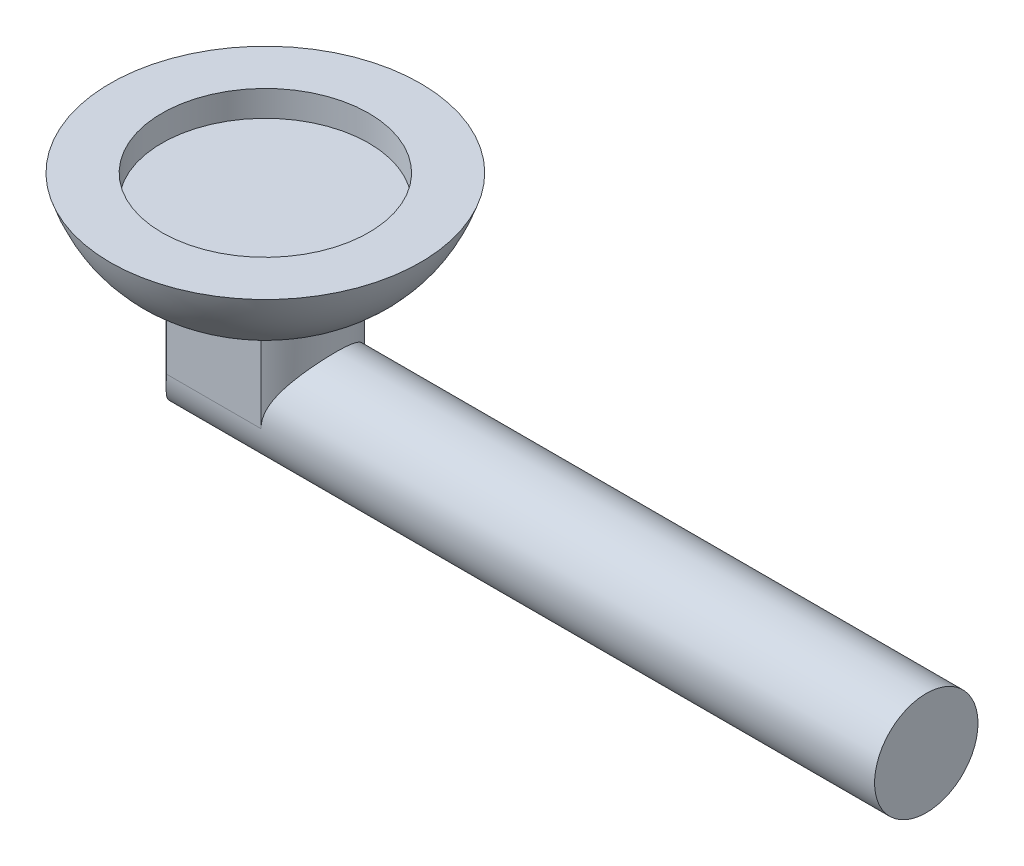
ISO-10303-21;
HEADER;
FILE_DESCRIPTION(('STEP AP214'),'2;1');
FILE_NAME('part.step','',(''),(''),'','','');
FILE_SCHEMA(('AUTOMOTIVE_DESIGN { 1 0 10303 214 1 1 1 1 }'));
ENDSEC;
DATA;
#1=APPLICATION_CONTEXT('core data for automotive mechanical design processes');
#2=APPLICATION_PROTOCOL_DEFINITION('international standard','automotive_design',2000,#1);
#3=PRODUCT_CONTEXT('',#1,'mechanical');
#4=PRODUCT('Part','Part','',(#3));
#5=PRODUCT_RELATED_PRODUCT_CATEGORY('part','',(#4));
#6=PRODUCT_DEFINITION_FORMATION('','',#4);
#7=PRODUCT_DEFINITION_CONTEXT('part definition',#1,'design');
#8=PRODUCT_DEFINITION('design','',#6,#7);
#9=PRODUCT_DEFINITION_SHAPE('','',#8);
#10=(LENGTH_UNIT() NAMED_UNIT(*) SI_UNIT(.MILLI.,.METRE.));
#11=(NAMED_UNIT(*) PLANE_ANGLE_UNIT() SI_UNIT($,.RADIAN.));
#12=(NAMED_UNIT(*) SI_UNIT($,.STERADIAN.) SOLID_ANGLE_UNIT());
#13=UNCERTAINTY_MEASURE_WITH_UNIT(LENGTH_MEASURE(1.E-05),#10,'distance_accuracy_value','');
#14=(GEOMETRIC_REPRESENTATION_CONTEXT(3) GLOBAL_UNCERTAINTY_ASSIGNED_CONTEXT((#13)) GLOBAL_UNIT_ASSIGNED_CONTEXT((#10,
#11,#12)) REPRESENTATION_CONTEXT('',''));
#15=CARTESIAN_POINT('',(0.,0.,0.));
#16=DIRECTION('',(0.,0.,1.));
#17=DIRECTION('',(1.,0.,0.));
#18=AXIS2_PLACEMENT_3D('',#15,#16,#17);
#19=CARTESIAN_POINT('',(-9.91502812902651,23.2402399637852,0.));
#20=DIRECTION('',(0.,1.,0.));
#21=DIRECTION('',(0.,0.,1.));
#22=AXIS2_PLACEMENT_3D('',#19,#20,#21);
#23=CYLINDRICAL_SURFACE('',#22,17.2201086238998);
#24=DIRECTION('',(0.,1.,0.));
#25=VECTOR('',#24,1.);
#26=CARTESIAN_POINT('',(1.7143373316901,23.2402399637852,-12.7));
#27=LINE('',#26,#25);
#28=CARTESIAN_POINT('',(1.71433733169009,1.67380828371263,-12.7));
#29=VERTEX_POINT('',#28);
#30=CARTESIAN_POINT('',(1.7143373316901,-18.9983682538271,-12.7));
#31=VERTEX_POINT('',#30);
#32=EDGE_CURVE('E59',#29,#31,#27,.F.);
#33=ORIENTED_EDGE('',*,*,#32,.F.);
#34=CARTESIAN_POINT('',(-9.91502812902651,1.67380828371263,0.));
#35=DIRECTION('',(0.,1.,0.));
#36=DIRECTION('',(0.,0.,1.));
#37=AXIS2_PLACEMENT_3D('',#34,#35,#36);
#38=CIRCLE('',#37,17.2201086238998);
#39=CARTESIAN_POINT('',(1.71433733169009,1.67380828371263,12.7));
#40=VERTEX_POINT('',#39);
#41=EDGE_CURVE('E134',#40,#29,#38,.T.);
#42=ORIENTED_EDGE('',*,*,#41,.F.);
#43=DIRECTION('',(0.,1.,0.));
#44=VECTOR('',#43,1.);
#45=CARTESIAN_POINT('',(1.7143373316901,23.2402399637852,12.7));
#46=LINE('',#45,#44);
#47=CARTESIAN_POINT('',(1.7143373316901,-18.9983682538271,12.7));
#48=VERTEX_POINT('',#47);
#49=EDGE_CURVE('E87',#40,#48,#46,.F.);
#50=ORIENTED_EDGE('',*,*,#49,.T.);
#51=CARTESIAN_POINT('',(1.71433733169011,-18.9983682538271,12.7));
#52=CARTESIAN_POINT('',(1.7143446941377,-19.2969520034112,12.6999963109426));
#53=CARTESIAN_POINT('',(1.72590065347217,-19.59558999845,12.6894412385571));
#54=CARTESIAN_POINT('',(1.77144051372062,-20.1896952576647,12.6475099082602));
#55=CARTESIAN_POINT('',(1.80543069678126,-20.4851616101421,12.6161278182467));
#56=CARTESIAN_POINT('',(1.89398332797913,-21.0707051620968,12.5332775861463));
#57=CARTESIAN_POINT('',(1.94858740325803,-21.3607702022285,12.4817687933108));
#58=CARTESIAN_POINT('',(2.07564494464589,-21.932995741394,12.3597585194379));
#59=CARTESIAN_POINT('',(2.14810878618213,-22.2151515391481,12.289245996166));
#60=CARTESIAN_POINT('',(2.30670109922394,-22.7662947948678,12.1315206449404));
#61=CARTESIAN_POINT('',(2.39263078614749,-23.0354089937798,12.0445474385829));
#62=CARTESIAN_POINT('',(2.5759060194827,-23.5637489081242,11.8543719126128));
#63=CARTESIAN_POINT('',(2.67325043116612,-23.8229756030755,11.7511712058152));
#64=CARTESIAN_POINT('',(2.87662507417323,-24.331141090249,11.5294565298254));
#65=CARTESIAN_POINT('',(2.98265301189039,-24.5800825731671,11.4109465995616));
#66=CARTESIAN_POINT('',(3.20100205991271,-25.0676029548769,11.1592857193114));
#67=CARTESIAN_POINT('',(3.31332410496066,-25.3061803050936,11.0261325918109));
#68=CARTESIAN_POINT('',(3.56499829103412,-25.8195544518061,10.7176568176423));
#69=CARTESIAN_POINT('',(3.70526069202105,-26.0920425280287,10.5392281770073));
#70=CARTESIAN_POINT('',(3.98843929469281,-26.6216431790104,10.1627380645268));
#71=CARTESIAN_POINT('',(4.13135570872687,-26.8787545164603,9.96467501617207));
#72=CARTESIAN_POINT('',(4.41711542963298,-27.3775100642536,9.54910849686227));
#73=CARTESIAN_POINT('',(4.55995838200937,-27.6191330901182,9.3315793350587));
#74=CARTESIAN_POINT('',(4.84269834986584,-28.0858767571835,8.87767807235367));
#75=CARTESIAN_POINT('',(4.98259513039161,-28.310996085756,8.64130447576672));
#76=CARTESIAN_POINT('',(5.28360295873029,-28.7859244712425,8.10226206718086));
#77=CARTESIAN_POINT('',(5.44354675853297,-29.0320172904071,7.79564175246821));
#78=CARTESIAN_POINT('',(5.75143850011917,-29.4972455358017,7.15679493757719));
#79=CARTESIAN_POINT('',(5.89938387155238,-29.71637519105,6.82456298034958));
#80=CARTESIAN_POINT('',(6.17886253278023,-30.1246103269797,6.13648581041433));
#81=CARTESIAN_POINT('',(6.31042543473308,-30.3137701533977,5.78068503758193));
#82=CARTESIAN_POINT('',(6.55337009551059,-30.6594626204667,5.04708571704476));
#83=CARTESIAN_POINT('',(6.66476202102419,-30.8160117037844,4.66929837872722));
#84=CARTESIAN_POINT('',(6.83440950892919,-31.0526684592701,4.00853606925857));
#85=CARTESIAN_POINT('',(6.89866577538483,-31.1417271193538,3.73026952545566));
#86=CARTESIAN_POINT('',(7.01403294018374,-31.3009691593781,3.1657475059002));
#87=CARTESIAN_POINT('',(7.06514688329846,-31.3711569114428,2.87949389763167));
#88=CARTESIAN_POINT('',(7.15317788717177,-31.4916948248981,2.30088383768682));
#89=CARTESIAN_POINT('',(7.19010428824501,-31.542058038236,2.00853153520239));
#90=CARTESIAN_POINT('',(7.24902482663505,-31.6222866602827,1.41951425658086));
#91=CARTESIAN_POINT('',(7.27101843563328,-31.6521513437587,1.12284912823628));
#92=CARTESIAN_POINT('',(7.29961750335431,-31.690966751111,0.526678365731202));
#93=CARTESIAN_POINT('',(7.30618519459837,-31.6998661455519,0.227167558931851));
#94=CARTESIAN_POINT('',(7.3036726628283,-31.6964593392094,-0.371665981132029));
#95=CARTESIAN_POINT('',(7.29459250068518,-31.6841532209166,-0.670988715123641));
#96=CARTESIAN_POINT('',(7.26098710670938,-31.6385263053424,-1.26720896301348));
#97=CARTESIAN_POINT('',(7.23645865185535,-31.6052011227915,-1.56410595772598));
#98=CARTESIAN_POINT('',(7.17249730067679,-31.5180431621267,-2.15323272998257));
#99=CARTESIAN_POINT('',(7.13306447353924,-31.4642104792098,-2.44546252918549));
#100=CARTESIAN_POINT('',(7.04159600905406,-31.338819557415,-3.01419742741553));
#101=CARTESIAN_POINT('',(6.98999554409382,-31.2678717686304,-3.29090805629935));
#102=CARTESIAN_POINT('',(6.87457305837729,-31.10834751483,-3.83656131115202));
#103=CARTESIAN_POINT('',(6.81075138035963,-31.0197715441863,-4.1055041547217));
#104=CARTESIAN_POINT('',(6.67201011838611,-30.8259746458111,-4.63433206679125));
#105=CARTESIAN_POINT('',(6.59709132271582,-30.720754900337,-4.89421777704758));
#106=CARTESIAN_POINT('',(6.4373441541846,-30.4946433456861,-5.40402222299978));
#107=CARTESIAN_POINT('',(6.35251218729965,-30.3737458507815,-5.65393729951451));
#108=CARTESIAN_POINT('',(6.16449339531682,-30.1032919999726,-6.16963916866406));
#109=CARTESIAN_POINT('',(6.06031381190856,-29.9520477354998,-6.43417866097672));
#110=CARTESIAN_POINT('',(5.84309809342854,-29.632751158683,-6.94922757314903));
#111=CARTESIAN_POINT('',(5.7300582227119,-29.4646917484461,-7.1997309980072));
#112=CARTESIAN_POINT('',(5.49687834706757,-29.1128182978635,-7.68622750683856));
#113=CARTESIAN_POINT('',(5.37673320130087,-28.9289928059866,-7.92220982619851));
#114=CARTESIAN_POINT('',(5.13128755891061,-28.5467157764985,-8.37900629128017));
#115=CARTESIAN_POINT('',(5.00598841344023,-28.3482680615347,-8.59982437238729));
#116=CARTESIAN_POINT('',(4.7275426030401,-27.8978003509194,-9.06723976897029));
#117=CARTESIAN_POINT('',(4.57368962086097,-27.642833990964,-9.31058436669582));
#118=CARTESIAN_POINT('',(4.26454966858857,-27.1140518455635,-9.77494403799986));
#119=CARTESIAN_POINT('',(4.10926242191007,-26.8402323558506,-9.99595470223033));
#120=CARTESIAN_POINT('',(3.80083503287385,-26.2742938037149,-10.4151314047123));
#121=CARTESIAN_POINT('',(3.64769571599409,-25.9821679296367,-10.6132888606366));
#122=CARTESIAN_POINT('',(3.3477244999129,-25.3801072487373,-10.9858401972272));
#123=CARTESIAN_POINT('',(3.20089106214091,-25.0701768296835,-11.1602398973612));
#124=CARTESIAN_POINT('',(2.94781684053184,-24.499425297814,-11.4502527682683));
#125=CARTESIAN_POINT('',(2.83950828634121,-24.2418871660213,-11.5705328329238));
#126=CARTESIAN_POINT('',(2.63247535297013,-23.7160068490367,-11.7947264447803));
#127=CARTESIAN_POINT('',(2.53375067485287,-23.4476650011999,-11.8986405025269));
#128=CARTESIAN_POINT('',(2.34905624984228,-22.9011396887763,-12.0889178850274));
#129=CARTESIAN_POINT('',(2.26306297350423,-22.6229755864773,-12.1753136980806));
#130=CARTESIAN_POINT('',(2.10682560661545,-22.0572305389199,-12.3296089481577));
#131=CARTESIAN_POINT('',(2.0365779158159,-21.7696517636089,-12.3975126142002));
#132=CARTESIAN_POINT('',(1.92584621817748,-21.238685806782,-12.5032236484652));
#133=CARTESIAN_POINT('',(1.88228729188734,-20.9965777241738,-12.5442400814241));
#134=CARTESIAN_POINT('',(1.80946789810681,-20.508299271419,-12.6123286498486));
#135=CARTESIAN_POINT('',(1.78020435211585,-20.2621297877071,-12.6394037876308));
#136=CARTESIAN_POINT('',(1.7371401208192,-19.7674758457858,-12.6791159789042));
#137=CARTESIAN_POINT('',(1.72332665636261,-19.5189934724325,-12.691764964799));
#138=CARTESIAN_POINT('',(1.71169932462034,-19.0213306222175,-12.7024176866502));
#139=CARTESIAN_POINT('',(1.71388573640034,-18.7721501332553,-12.7004211671634));
#140=CARTESIAN_POINT('',(1.73415907519444,-18.2751521507464,-12.6818280372229));
#141=CARTESIAN_POINT('',(1.75223591574345,-18.0273338929134,-12.6652406883078));
#142=CARTESIAN_POINT('',(1.80352576064349,-17.5346713440331,-12.6177987579236));
#143=CARTESIAN_POINT('',(1.83673875924402,-17.2898270518559,-12.5869441818749));
#144=CARTESIAN_POINT('',(1.91707226842101,-16.8043164459371,-12.5114575182048));
#145=CARTESIAN_POINT('',(1.96420870322451,-16.5636552519415,-12.4668096525084));
#146=CARTESIAN_POINT('',(2.07078175908575,-16.0878131676694,-12.3643826087583));
#147=CARTESIAN_POINT('',(2.13022546825205,-15.852635522752,-12.3065958617588));
#148=CARTESIAN_POINT('',(2.28503316952809,-15.2976152534639,-12.153464170309));
#149=CARTESIAN_POINT('',(2.38534038945443,-14.9807518068013,-12.0522784513385));
#150=CARTESIAN_POINT('',(2.60157503898524,-14.3607250508389,-11.8275557271415));
#151=CARTESIAN_POINT('',(2.71750246567226,-14.0575617389804,-11.7040187260898));
#152=CARTESIAN_POINT('',(2.96085975217501,-13.4648800763016,-11.4357554954498));
#153=CARTESIAN_POINT('',(3.08830988413996,-13.1753871933952,-11.2909916314758));
#154=CARTESIAN_POINT('',(3.35069241883282,-12.6109081433513,-10.981527903001));
#155=CARTESIAN_POINT('',(3.48562406272166,-12.3359205104679,-10.8168300583781));
#156=CARTESIAN_POINT('',(3.76413581679969,-11.7918602297764,-10.4625537327344));
#157=CARTESIAN_POINT('',(3.9078544610283,-11.5232735850152,-10.2723386269333));
#158=CARTESIAN_POINT('',(4.19653347609468,-11.0020503040896,-9.872025140317));
#159=CARTESIAN_POINT('',(4.3414938986059,-10.7494143353699,-9.66192592838384));
#160=CARTESIAN_POINT('',(4.62967717770611,-10.2607942186587,-9.22240271010662));
#161=CARTESIAN_POINT('',(4.77290099282122,-10.0248005027827,-8.99298997661859));
#162=CARTESIAN_POINT('',(5.05500832739846,-9.57013288218604,-8.51511220023532));
#163=CARTESIAN_POINT('',(5.19389200005217,-9.35145836574023,-8.26664783086651));
#164=CARTESIAN_POINT('',(5.46318056451691,-8.93496451019896,-7.75407473843604));
#165=CARTESIAN_POINT('',(5.59366513672432,-8.73693263167752,-7.49018098322167));
#166=CARTESIAN_POINT('',(5.84544205560144,-8.36023405233881,-6.94477593369048));
#167=CARTESIAN_POINT('',(5.96673541931169,-8.18156520798768,-6.66326659491423));
#168=CARTESIAN_POINT('',(6.19767090516277,-7.8452584214185,-6.08361256111666));
#169=CARTESIAN_POINT('',(6.30731983824974,-7.68760817127126,-5.78547774789349));
#170=CARTESIAN_POINT('',(6.5126735883258,-7.39500211842608,-5.17366545247375));
#171=CARTESIAN_POINT('',(6.60838074919603,-7.26004250040518,-4.85999059476918));
#172=CARTESIAN_POINT('',(6.77056597409121,-7.03290776631061,-4.26651571254046));
#173=CARTESIAN_POINT('',(6.8392741638848,-6.93735475879459,-3.98861485837037));
#174=CARTESIAN_POINT('',(6.96367072482601,-6.76513959026347,-3.42419823459457));
#175=CARTESIAN_POINT('',(7.01936140062053,-6.68847408523698,-3.13768400007172));
#176=CARTESIAN_POINT('',(7.11659139716245,-6.55505642628787,-2.55782238337018));
#177=CARTESIAN_POINT('',(7.1581370923302,-6.49829530213089,-2.26447814297191));
#178=CARTESIAN_POINT('',(7.22622513846984,-6.40545675857679,-1.67279649123881));
#179=CARTESIAN_POINT('',(7.25276731894385,-6.36937957422906,-1.3744590232013));
#180=CARTESIAN_POINT('',(7.29030671292831,-6.31839563783882,-0.774140251578351));
#181=CARTESIAN_POINT('',(7.30125943706071,-6.30354947457209,-0.472150989944558));
#182=CARTESIAN_POINT('',(7.3072244770185,-6.29546104999589,0.13227617760288));
#183=CARTESIAN_POINT('',(7.30223676194812,-6.3022188305592,0.434714084384954));
#184=CARTESIAN_POINT('',(7.27643527011965,-6.33723039201056,1.03769263703156));
#185=CARTESIAN_POINT('',(7.25561962343534,-6.36548671275592,1.33823305449462));
#186=CARTESIAN_POINT('',(7.19863364185268,-6.44305185585195,1.93509622674748));
#187=CARTESIAN_POINT('',(7.16246352047046,-6.49236038545505,2.2314190401272));
#188=CARTESIAN_POINT('',(7.07740692905215,-6.60876716916528,2.80532732945882));
#189=CARTESIAN_POINT('',(7.02912443363572,-6.6750228055313,3.08317464176174));
#190=CARTESIAN_POINT('',(6.92012950073053,-6.82532145754821,3.63149340660636));
#191=CARTESIAN_POINT('',(6.85941750920228,-6.90936383502849,3.9019651233842));
#192=CARTESIAN_POINT('',(6.7266472875757,-7.09427820186328,4.4341861303844));
#193=CARTESIAN_POINT('',(6.65458981790766,-7.1951490633162,4.69593600376443));
#194=CARTESIAN_POINT('',(6.50028999569318,-7.4127558451546,5.20974703398968));
#195=CARTESIAN_POINT('',(6.41804393371284,-7.52949754526616,5.46180461806888));
#196=CARTESIAN_POINT('',(6.23589114313657,-7.79035181773698,5.98020419898996));
#197=CARTESIAN_POINT('',(6.13503981584692,-7.93603747491767,6.24542240776926));
#198=CARTESIAN_POINT('',(5.92422441562499,-8.2441870014601,6.76226004609656));
#199=CARTESIAN_POINT('',(5.81425651746705,-8.40665792086823,7.0138736933926));
#200=CARTESIAN_POINT('',(5.58692112927723,-8.74730028977338,7.50296456103397));
#201=CARTESIAN_POINT('',(5.46954900469692,-8.92548160122994,7.74043274281428));
#202=CARTESIAN_POINT('',(5.22927747557721,-9.29641945384956,8.20057986065822));
#203=CARTESIAN_POINT('',(5.10637950390095,-9.4891722253358,8.42326259394759));
#204=CARTESIAN_POINT('',(4.83295233129385,-9.92669226544468,8.89477278757287));
#205=CARTESIAN_POINT('',(4.6816327546828,-10.1743582923298,9.14045877434138));
#206=CARTESIAN_POINT('',(4.3768018131569,-10.6883087008996,9.61010553413782));
#207=CARTESIAN_POINT('',(4.22329005016174,-10.9545964992334,9.83406230228343));
#208=CARTESIAN_POINT('',(3.91741836731278,-11.5052448070403,10.2598394480732));
#209=CARTESIAN_POINT('',(3.7650591782985,-11.7896158575979,10.4616467240187));
#210=CARTESIAN_POINT('',(3.46541843117187,-12.375854290779,10.8422512974507));
#211=CARTESIAN_POINT('',(3.31813582689953,-12.6777180337905,11.0210533567567));
#212=CARTESIAN_POINT('',(3.05848571161625,-13.2432642721523,11.3248662754034));
#213=CARTESIAN_POINT('',(2.94457832309952,-13.504145198746,11.4537819919987));
#214=CARTESIAN_POINT('',(2.72594230983187,-14.0374080159863,11.6946335544735));
#215=CARTESIAN_POINT('',(2.62121378944993,-14.3097900373548,11.8065692072906));
#216=CARTESIAN_POINT('',(2.42429929270591,-14.8650766985652,12.012217791929));
#217=CARTESIAN_POINT('',(2.33208779827514,-15.1479583858455,12.1059679706552));
#218=CARTESIAN_POINT('',(2.16339594930242,-15.7239389967101,12.2742836173747));
#219=CARTESIAN_POINT('',(2.0869103537454,-16.0170344781055,12.3488554790652));
#220=CARTESIAN_POINT('',(1.9712139720493,-16.5315163380777,12.4600950398174));
#221=CARTESIAN_POINT('',(1.92751621826825,-16.750866925483,12.5015597301922));
#222=CARTESIAN_POINT('',(1.85156505008703,-17.193362869218,12.5730726569776));
#223=CARTESIAN_POINT('',(1.81930926919769,-17.4165074308413,12.6031232542022));
#224=CARTESIAN_POINT('',(1.76726829018139,-17.8654223990859,12.6513778243313));
#225=CARTESIAN_POINT('',(1.74747704140629,-18.0911914773975,12.6695875452829));
#226=CARTESIAN_POINT('',(1.72101030815202,-18.5440862113,12.6938986085919));
#227=CARTESIAN_POINT('',(1.71433173048292,-18.7712115342789,12.7000028065633));
#228=CARTESIAN_POINT('',(1.71433733169011,-18.9983682538271,12.7));
#229=B_SPLINE_CURVE_WITH_KNOTS('',3,(#51,#52,#53,#54,#55,#56,#57,#58,#59,#60,#61,#62,#63,#64,
#65,#66,#67,#68,#69,#70,#71,#72,#73,#74,#75,#76,#77,#78,#79,#80,#81,#82,#83,#84,#85,#86,#87,#88,
#89,#90,#91,#92,#93,#94,#95,#96,#97,#98,#99,#100,#101,#102,#103,#104,#105,#106,#107,#108,#109,
#110,#111,#112,#113,#114,#115,#116,#117,#118,#119,#120,#121,#122,#123,#124,#125,#126,#127,#128,
#129,#130,#131,#132,#133,#134,#135,#136,#137,#138,#139,#140,#141,#142,#143,#144,#145,#146,#147,
#148,#149,#150,#151,#152,#153,#154,#155,#156,#157,#158,#159,#160,#161,#162,#163,#164,#165,#166,
#167,#168,#169,#170,#171,#172,#173,#174,#175,#176,#177,#178,#179,#180,#181,#182,#183,#184,#185,
#186,#187,#188,#189,#190,#191,#192,#193,#194,#195,#196,#197,#198,#199,#200,#201,#202,#203,#204,
#205,#206,#207,#208,#209,#210,#211,#212,#213,#214,#215,#216,#217,#218,#219,#220,#221,#222,#223,
#224,#225,#226,#227,#228),.UNSPECIFIED.,.T.,.F.,(4,2,2,2,2,2,2,2,2,2,2,2,2,2,2,2,2,2,2,2,2,2,2,
2,2,2,2,2,2,2,2,2,2,2,2,2,2,2,2,2,2,2,2,2,2,2,2,2,2,2,2,2,2,2,2,2,2,2,2,2,2,2,2,2,2,2,2,2,2,2,2,
2,2,2,2,2,2,2,2,2,2,2,2,2,2,2,2,2,4),(0.,0.895446484630562,1.79114382323394,2.68865966911814,
3.58669815068051,4.47254957749824,5.35831301710268,6.24384324719341,7.12950533841618,
8.1924420852325,9.25546424786682,10.319910653561,11.384441628792,12.6560589082192,
13.9279478828442,15.1975034097672,16.4664172562008,17.3629808102038,18.2593364636876,
19.1551009895061,20.050897205605,20.9488843356002,21.846867972383,22.7450390201419,
23.6432058985889,24.5131366896555,25.3830430874606,26.2528877209298,27.1230487010826,
28.0882390017338,29.0538384545662,30.0201452985247,30.9862004137712,32.1387505833172,
33.2915278560153,34.4447366443099,35.5976624439593,36.5095013177899,37.4213117407249,
38.3314153883416,39.2413107267998,39.988721436826,40.7359711214245,41.4826022788959,
42.2292464589444,42.9754170478193,43.7215873532103,44.4686143794396,45.2160728425265,
46.2567560911115,47.2974391453243,48.3399901132389,49.3824355294507,50.4589052488897,
51.5354199826166,52.6113106789935,53.6871633572702,54.7505331304567,55.8137850655771,
56.8764116281694,57.9388593360263,58.8433125430175,59.7476055023042,60.6514904018626,
61.5553855728392,62.4618551539198,63.3683264919221,64.2749049379141,65.1814707776284,
66.0496110783641,66.9177202363671,67.7857712341326,68.6541392034339,69.6101002129448,
70.5664643846017,71.5234332326598,72.4801553519308,73.6197968178999,74.7596479321912,
75.9001696895603,77.0404549907329,77.9772179923009,78.9139916440179,79.8488258838731,
80.7833480620392,81.4652194167248,82.1469496608406,82.8283487175836,83.5095870176015),.UNSPECIFIED.);
#230=EDGE_CURVE('E45',#31,#48,#229,.T.);
#231=ORIENTED_EDGE('',*,*,#230,.F.);
#232=EDGE_LOOP('',(#33,#42,#50,#231));
#233=FACE_BOUND('',#232,.T.);
#234=ADVANCED_FACE('F32',(#233),#23,.T.);
#235=DIRECTION('',(0.,1.,0.));
#236=VECTOR('',#235,1.);
#237=CARTESIAN_POINT('',(-21.5443935897431,23.2402399637852,-12.7));
#238=LINE('',#237,#236);
#239=CARTESIAN_POINT('',(-21.5443935897431,-18.9983682538271,-12.7));
#240=VERTEX_POINT('',#239);
#241=CARTESIAN_POINT('',(-21.5443935897431,1.67380828371263,-12.7));
#242=VERTEX_POINT('',#241);
#243=EDGE_CURVE('E99',#240,#242,#238,.T.);
#244=ORIENTED_EDGE('',*,*,#243,.F.);
#245=CARTESIAN_POINT('',(-21.5443935897431,-18.9983682538271,12.7));
#246=CARTESIAN_POINT('',(-21.5443833747081,-19.1490419742191,12.7000032982609));
#247=CARTESIAN_POINT('',(-21.5473235286102,-19.2996866756049,12.6973177043451));
#248=CARTESIAN_POINT('',(-21.5590051022661,-19.6005383326839,12.6866084800095));
#249=CARTESIAN_POINT('',(-21.5677456307416,-19.7507453520697,12.6785856696992));
#250=CARTESIAN_POINT('',(-21.6024688815819,-20.1995493724768,12.6466168285036));
#251=CARTESIAN_POINT('',(-21.6369541526676,-20.4969967543146,12.6147700036274));
#252=CARTESIAN_POINT('',(-21.7260953133237,-21.0820873391036,12.531338974698));
#253=CARTESIAN_POINT('',(-21.7804973739145,-21.3698061931707,12.4800028594491));
#254=CARTESIAN_POINT('',(-21.9068424478872,-21.9374307620647,12.3586481710885));
#255=CARTESIAN_POINT('',(-21.9787932307087,-22.2173329548367,12.2886213216291));
#256=CARTESIAN_POINT('',(-22.1366128373899,-22.7657942145586,12.1316642974957));
#257=CARTESIAN_POINT('',(-22.2223721452205,-23.0344231249809,12.0448661337658));
#258=CARTESIAN_POINT('',(-22.405270701718,-23.5618329337484,11.8550975376427));
#259=CARTESIAN_POINT('',(-22.5024089289211,-23.8206147132931,11.7521285565908));
#260=CARTESIAN_POINT('',(-22.7057200288847,-24.3288559379794,11.530525723847));
#261=CARTESIAN_POINT('',(-22.8119224173419,-24.5782808004172,11.411839943407));
#262=CARTESIAN_POINT('',(-23.0306475371331,-25.0667304605676,11.1597726546015));
#263=CARTESIAN_POINT('',(-23.1431712170673,-25.3057536877639,11.0263889376971));
#264=CARTESIAN_POINT('',(-23.3951135549874,-25.8196748067914,10.7175844982928));
#265=CARTESIAN_POINT('',(-23.5354374438099,-26.0922766426203,10.5390748867258));
#266=CARTESIAN_POINT('',(-23.8187395606113,-26.6220907468902,10.1624067324459));
#267=CARTESIAN_POINT('',(-23.9617179928993,-26.8793018242817,9.96424667218267));
#268=CARTESIAN_POINT('',(-24.2474770983827,-27.3780299012289,9.54864760756214));
#269=CARTESIAN_POINT('',(-24.3902576418659,-27.6195392207404,9.33119929005515));
#270=CARTESIAN_POINT('',(-24.6728742186803,-28.0860692188433,8.87747597476141));
#271=CARTESIAN_POINT('',(-24.8127100175395,-28.3110885879524,8.64119948491533));
#272=CARTESIAN_POINT('',(-25.1136459255411,-28.7859035033208,8.10228586704466));
#273=CARTESIAN_POINT('',(-25.2735770894081,-29.0319773941294,7.79569145626027));
#274=CARTESIAN_POINT('',(-25.5814459211895,-29.4971724618188,7.1569003621097));
#275=CARTESIAN_POINT('',(-25.7293810116213,-29.7162878515854,6.82469820640111));
#276=CARTESIAN_POINT('',(-26.0088649349982,-30.1245326427867,6.13662870370606));
#277=CARTESIAN_POINT('',(-26.1404407782453,-30.3137116161814,5.78080189422516));
#278=CARTESIAN_POINT('',(-26.383408349236,-30.6594373204207,5.04714676103351));
#279=CARTESIAN_POINT('',(-26.4948102483631,-30.8160005016534,4.66932965217048));
#280=CARTESIAN_POINT('',(-26.6644664194113,-31.0526693689474,4.0085335319857));
#281=CARTESIAN_POINT('',(-26.7287232237877,-31.1417287690764,3.73026437183831));
#282=CARTESIAN_POINT('',(-26.8440912100879,-31.300971929653,3.16573699087777));
#283=CARTESIAN_POINT('',(-26.8952054373755,-31.371160063074,2.87948063790876));
#284=CARTESIAN_POINT('',(-26.9832359183056,-31.4916972452012,2.30087035202968));
#285=CARTESIAN_POINT('',(-27.0201617735345,-31.5420597109447,2.00852068434138));
#286=CARTESIAN_POINT('',(-27.0790814914197,-31.6222872124479,1.41950877309471));
#287=CARTESIAN_POINT('',(-27.101074825723,-31.652151522928,1.12284637731968));
#288=CARTESIAN_POINT('',(-27.1296737558674,-31.6909667436266,0.526678479715035));
#289=CARTESIAN_POINT('',(-27.1362414476426,-31.6998661387751,0.227167786533718));
#290=CARTESIAN_POINT('',(-27.1337289287405,-31.6964593498513,-0.37166552935523));
#291=CARTESIAN_POINT('',(-27.1246487787929,-31.684153248078,-0.670988152788254));
#292=CARTESIAN_POINT('',(-27.0910434078051,-31.6385263638079,-1.267208406418));
#293=CARTESIAN_POINT('',(-27.0665149521915,-31.605201180324,-1.56410551556854));
#294=CARTESIAN_POINT('',(-27.0025535880691,-31.5180432021916,-2.15323251245315));
#295=CARTESIAN_POINT('',(-26.9631207488282,-31.4642105028516,-2.44546242187143));
#296=CARTESIAN_POINT('',(-26.8716524246891,-31.3388197734254,-3.01419644773758));
#297=CARTESIAN_POINT('',(-26.820052163586,-31.2678722655474,-3.29090611835136));
#298=CARTESIAN_POINT('',(-26.7046301673848,-31.1083486935494,-3.83655751758924));
#299=CARTESIAN_POINT('',(-26.6408087749545,-31.019773123699,-4.10549946376891));
#300=CARTESIAN_POINT('',(-26.5020676689325,-30.8259764593239,-4.63432749911261));
#301=CARTESIAN_POINT('',(-26.4271486661536,-30.7207564308638,-4.89421416696016));
#302=CARTESIAN_POINT('',(-26.2674010083578,-30.4946441952191,-5.40402046694507));
#303=CARTESIAN_POINT('',(-26.1825687590158,-30.3737463018314,-5.65393643959666));
#304=CARTESIAN_POINT('',(-25.994546525195,-30.1032875004298,-6.16964774823943));
#305=CARTESIAN_POINT('',(-25.8903634770091,-29.9520381647185,-6.43419540089684));
#306=CARTESIAN_POINT('',(-25.6731403245858,-29.6327304192153,-6.9492597249597));
#307=CARTESIAN_POINT('',(-25.5600964843625,-29.4646649108536,-7.19977040076935));
#308=CARTESIAN_POINT('',(-25.3269157163964,-29.1127894726297,-7.68626506168796));
#309=CARTESIAN_POINT('',(-25.2067740916874,-28.9289690798612,-7.92223921143074));
#310=CARTESIAN_POINT('',(-24.9613358809483,-28.5467032076244,-8.37902027628986));
#311=CARTESIAN_POINT('',(-24.8360406463707,-28.3482615516843,-8.59983112770356));
#312=CARTESIAN_POINT('',(-24.5576329018216,-27.8978554194311,-9.06718262799238));
#313=CARTESIAN_POINT('',(-24.4038150395613,-27.6429485932388,-9.31047498108657));
#314=CARTESIAN_POINT('',(-24.0947448481698,-27.1142931661107,-9.77474086051765));
#315=CARTESIAN_POINT('',(-23.9394922390746,-26.8405408176179,-9.9957099260389));
#316=CARTESIAN_POINT('',(-23.631062002155,-26.2746170478199,-10.4149082847995));
#317=CARTESIAN_POINT('',(-23.4778861906012,-25.9824306267966,-10.6131186797955));
#318=CARTESIAN_POINT('',(-23.1778451489195,-25.3802431648633,-10.9857637111487));
#319=CARTESIAN_POINT('',(-23.0309783272335,-25.0702466635463,-11.1602043682632));
#320=CARTESIAN_POINT('',(-22.7777401652968,-24.4991255725121,-11.4504051015195));
#321=CARTESIAN_POINT('',(-22.6693068696041,-24.2412747232678,-11.570818971115));
#322=CARTESIAN_POINT('',(-22.4620470966486,-23.7147339284094,-11.795243991261));
#323=CARTESIAN_POINT('',(-22.363220626075,-23.4460439752482,-11.8992551303901));
#324=CARTESIAN_POINT('',(-22.1785769588056,-22.8994407393871,-12.0894589841336));
#325=CARTESIAN_POINT('',(-22.092706895731,-22.6215709067712,-12.1757246606478));
#326=CARTESIAN_POINT('',(-21.9366981201098,-22.0564765721298,-12.329786633288));
#327=CARTESIAN_POINT('',(-21.8665528123165,-21.7692560500576,-12.3975906751277));
#328=CARTESIAN_POINT('',(-21.7640092804411,-21.2775623238261,-12.4954841456268));
#329=CARTESIAN_POINT('',(-21.7266562479014,-21.0751351271812,-12.5307447364764));
#330=CARTESIAN_POINT('',(-21.6618122614144,-20.6672953982174,-12.5915516619955));
#331=CARTESIAN_POINT('',(-21.6343186292846,-20.461883692402,-12.6171006348177));
#332=CARTESIAN_POINT('',(-21.5897891830937,-20.0474380791696,-12.6583205645383));
#333=CARTESIAN_POINT('',(-21.5728293645703,-19.838388785805,-12.6739197606306));
#334=CARTESIAN_POINT('',(-21.5500985794034,-19.4190252503029,-12.6947753659844));
#335=CARTESIAN_POINT('',(-21.5443355017315,-19.2087102209368,-12.7000244828519));
#336=CARTESIAN_POINT('',(-21.5443935897431,-18.9983682538271,-12.7));
#337=B_SPLINE_CURVE_WITH_KNOTS('',3,(#245,#246,#247,#248,#249,#250,#251,#252,#253,#254,#255,
#256,#257,#258,#259,#260,#261,#262,#263,#264,#265,#266,#267,#268,#269,#270,#271,#272,#273,#274,
#275,#276,#277,#278,#279,#280,#281,#282,#283,#284,#285,#286,#287,#288,#289,#290,#291,#292,#293,
#294,#295,#296,#297,#298,#299,#300,#301,#302,#303,#304,#305,#306,#307,#308,#309,#310,#311,#312,
#313,#314,#315,#316,#317,#318,#319,#320,#321,#322,#323,#324,#325,#326,#327,#328,#329,#330,#331,
#332,#333,#334,#335,#336),.UNSPECIFIED.,.F.,.F.,(4,2,2,2,2,2,2,2,2,2,2,2,2,2,2,2,2,2,2,2,2,2,2,
2,2,2,2,2,2,2,2,2,2,2,2,2,2,2,2,2,2,2,2,2,2,4),(0.,0.451912425076439,0.903755425933914,
1.80544905872103,2.69602984938041,3.58700564965247,4.47123478458955,5.35538460470076,
6.24253217513746,7.1298132322382,8.19320640810676,9.25668177096166,10.3206734472406,
11.384749524727,12.6562638023942,13.9280505583622,15.1977088025271,16.4667251119333,
17.3632969616625,18.2596608724882,19.1554171211249,20.0512050623838,20.9491918516571,
21.8471751558322,22.7453465427064,23.6435137553865,24.5134415013983,25.3833448591189,
26.2531925227486,27.1233565583396,28.0885773876745,29.0542073961892,30.0204837289825,
30.9865082667616,32.1387994890098,33.2913205176169,34.4447917542304,35.5979702769941,
36.5108935159808,37.4238173906413,38.3329091791976,39.2416189618551,39.8677184171949,
40.4936476714047,41.1240417397848,41.7548798087886),.UNSPECIFIED.);
#338=CARTESIAN_POINT('',(-21.5443935897431,-18.9983682538271,12.7));
#339=VERTEX_POINT('',#338);
#340=EDGE_CURVE('E11',#339,#240,#337,.T.);
#341=ORIENTED_EDGE('',*,*,#340,.F.);
#342=DIRECTION('',(0.,1.,0.));
#343=VECTOR('',#342,1.);
#344=CARTESIAN_POINT('',(-21.5443935897431,23.2402399637852,12.7));
#345=LINE('',#344,#343);
#346=CARTESIAN_POINT('',(-21.5443935897431,1.67380828371263,12.7));
#347=VERTEX_POINT('',#346);
#348=EDGE_CURVE('E78',#339,#347,#345,.T.);
#349=ORIENTED_EDGE('',*,*,#348,.T.);
#350=EDGE_CURVE('E100',#242,#347,#38,.T.);
#351=ORIENTED_EDGE('',*,*,#350,.F.);
#352=EDGE_LOOP('',(#244,#341,#349,#351));
#353=FACE_BOUND('',#352,.T.);
#354=ADVANCED_FACE('F97',(#353),#23,.T.);
#355=CARTESIAN_POINT('',(28.1849718709735,23.2402399637852,0.));
#356=DIRECTION('',(0.,-1.,0.));
#357=DIRECTION('',(0.,0.,-1.));
#358=AXIS2_PLACEMENT_3D('',#355,#356,#357);
#359=PLANE('',#358);
#360=CARTESIAN_POINT('',(-9.91502812902651,23.2402399637852,0.));
#361=DIRECTION('',(0.,1.,0.));
#362=DIRECTION('',(0.,0.,1.));
#363=AXIS2_PLACEMENT_3D('',#360,#361,#362);
#364=CIRCLE('',#363,25.4);
#365=CARTESIAN_POINT('',(-9.91502812902651,23.2402399637852,25.4));
#366=VERTEX_POINT('',#365);
#367=EDGE_CURVE('E149',#366,#366,#364,.T.);
#368=ORIENTED_EDGE('',*,*,#367,.F.);
#369=EDGE_LOOP('',(#368));
#370=FACE_BOUND('',#369,.T.);
#371=CARTESIAN_POINT('',(-9.91502812902651,23.2402399637852,0.));
#372=DIRECTION('',(0.,1.,0.));
#373=DIRECTION('',(0.,0.,1.));
#374=AXIS2_PLACEMENT_3D('',#371,#372,#373);
#375=CIRCLE('',#374,38.1);
#376=CARTESIAN_POINT('',(-9.91502812902651,23.2402399637852,38.1));
#377=VERTEX_POINT('',#376);
#378=EDGE_CURVE('E129',#377,#377,#375,.T.);
#379=ORIENTED_EDGE('',*,*,#378,.T.);
#380=EDGE_LOOP('',(#379));
#381=FACE_BOUND('',#380,.T.);
#382=ADVANCED_FACE('F34',(#370,#381),#359,.F.);
#383=CARTESIAN_POINT('',(7.30508049487329,1.67380828371262,0.));
#384=CARTESIAN_POINT('',(17.6888902225342,5.05702423988496,0.));
#385=CARTESIAN_POINT('',(24.6488540145802,12.2458347999132,0.));
#386=CARTESIAN_POINT('',(28.1849718709735,23.2402399637852,0.));
#387=B_SPLINE_CURVE_WITH_KNOTS('',3,(#383,#384,#385,#386),.UNSPECIFIED.,.F.,.F.,(4,4),
(0.179471998038489,1.),.UNSPECIFIED.);
#388=CARTESIAN_POINT('',(-9.91502812902651,23.2402399637852,0.));
#389=DIRECTION('',(0.,1.,0.));
#390=AXIS1_PLACEMENT('',#388,#389);
#391=SURFACE_OF_REVOLUTION('',#387,#390);
#392=ORIENTED_EDGE('',*,*,#378,.F.);
#393=EDGE_LOOP('',(#392));
#394=FACE_BOUND('',#393,.T.);
#395=EDGE_CURVE('E112',#347,#40,#38,.T.);
#396=ORIENTED_EDGE('',*,*,#395,.T.);
#397=ORIENTED_EDGE('',*,*,#41,.T.);
#398=EDGE_CURVE('E137',#29,#242,#38,.T.);
#399=ORIENTED_EDGE('',*,*,#398,.T.);
#400=ORIENTED_EDGE('',*,*,#350,.T.);
#401=EDGE_LOOP('',(#396,#397,#399,#400));
#402=FACE_BOUND('',#401,.T.);
#403=ADVANCED_FACE('F117',(#394,#402),#391,.T.);
#404=CARTESIAN_POINT('',(152.4,-18.9983682538271,0.));
#405=DIRECTION('',(-1.,0.,0.));
#406=DIRECTION('',(0.,0.,1.));
#407=AXIS2_PLACEMENT_3D('',#404,#405,#406);
#408=CYLINDRICAL_SURFACE('',#407,12.7);
#409=ORIENTED_EDGE('',*,*,#230,.T.);
#410=DIRECTION('',(1.,0.,0.));
#411=VECTOR('',#410,1.);
#412=CARTESIAN_POINT('',(-48.0150281290265,-18.9983682538271,12.7));
#413=LINE('',#412,#411);
#414=EDGE_CURVE('E81',#339,#48,#413,.T.);
#415=ORIENTED_EDGE('',*,*,#414,.F.);
#416=ORIENTED_EDGE('',*,*,#340,.T.);
#417=DIRECTION('',(1.,0.,0.));
#418=VECTOR('',#417,1.);
#419=CARTESIAN_POINT('',(-48.0150281290265,-18.9983682538271,-12.7));
#420=LINE('',#419,#418);
#421=EDGE_CURVE('E143',#240,#31,#420,.T.);
#422=ORIENTED_EDGE('',*,*,#421,.T.);
#423=EDGE_LOOP('',(#409,#415,#416,#422));
#424=FACE_BOUND('',#423,.T.);
#425=CARTESIAN_POINT('',(152.4,-18.9983682538271,0.));
#426=DIRECTION('',(1.,0.,0.));
#427=DIRECTION('',(0.,0.,-1.));
#428=AXIS2_PLACEMENT_3D('',#425,#426,#427);
#429=CIRCLE('',#428,12.7);
#430=CARTESIAN_POINT('',(152.4,-18.9983682538271,-12.7));
#431=VERTEX_POINT('',#430);
#432=EDGE_CURVE('E102',#431,#431,#429,.T.);
#433=ORIENTED_EDGE('',*,*,#432,.F.);
#434=EDGE_LOOP('',(#433));
#435=FACE_BOUND('',#434,.T.);
#436=ADVANCED_FACE('F91',(#424,#435),#408,.T.);
#437=CARTESIAN_POINT('',(152.4,-18.9983682538271,0.));
#438=DIRECTION('',(1.,0.,0.));
#439=DIRECTION('',(0.,0.,-1.));
#440=AXIS2_PLACEMENT_3D('',#437,#438,#439);
#441=PLANE('',#440);
#442=ORIENTED_EDGE('',*,*,#432,.T.);
#443=EDGE_LOOP('',(#442));
#444=FACE_BOUND('',#443,.T.);
#445=ADVANCED_FACE('F180',(#444),#441,.T.);
#446=CARTESIAN_POINT('',(-48.0150281290265,1.67380828371263,0.));
#447=DIRECTION('',(0.,-1.,0.));
#448=DIRECTION('',(0.,0.,-1.));
#449=AXIS2_PLACEMENT_3D('',#446,#447,#448);
#450=PLANE('',#449);
#451=DIRECTION('',(1.,0.,0.));
#452=VECTOR('',#451,1.);
#453=CARTESIAN_POINT('',(-48.0150281290265,1.67380828371263,-12.7));
#454=LINE('',#453,#452);
#455=EDGE_CURVE('E141',#242,#29,#454,.T.);
#456=ORIENTED_EDGE('',*,*,#455,.F.);
#457=ORIENTED_EDGE('',*,*,#398,.F.);
#458=EDGE_LOOP('',(#456,#457));
#459=FACE_BOUND('',#458,.T.);
#460=ADVANCED_FACE('F140',(#459),#450,.T.);
#461=CARTESIAN_POINT('',(-48.0150281290265,1.67380828371263,0.));
#462=DIRECTION('',(0.,1.,0.));
#463=DIRECTION('',(0.,0.,1.));
#464=AXIS2_PLACEMENT_3D('',#461,#462,#463);
#465=PLANE('',#464);
#466=DIRECTION('',(1.,0.,0.));
#467=VECTOR('',#466,1.);
#468=CARTESIAN_POINT('',(-48.0150281290265,1.67380828371263,12.7));
#469=LINE('',#468,#467);
#470=EDGE_CURVE('E51',#347,#40,#469,.T.);
#471=ORIENTED_EDGE('',*,*,#470,.T.);
#472=ORIENTED_EDGE('',*,*,#395,.F.);
#473=EDGE_LOOP('',(#471,#472));
#474=FACE_BOUND('',#473,.T.);
#475=ADVANCED_FACE('F196',(#474),#465,.F.);
#476=CARTESIAN_POINT('',(-48.0150281290265,0.,-12.7));
#477=DIRECTION('',(0.,0.,-1.));
#478=DIRECTION('',(-1.,0.,0.));
#479=AXIS2_PLACEMENT_3D('',#476,#477,#478);
#480=PLANE('',#479);
#481=ORIENTED_EDGE('',*,*,#243,.T.);
#482=ORIENTED_EDGE('',*,*,#455,.T.);
#483=ORIENTED_EDGE('',*,*,#32,.T.);
#484=ORIENTED_EDGE('',*,*,#421,.F.);
#485=EDGE_LOOP('',(#481,#482,#483,#484));
#486=FACE_BOUND('',#485,.T.);
#487=ADVANCED_FACE('F142',(#486),#480,.T.);
#488=CARTESIAN_POINT('',(-48.0150281290265,0.,12.7));
#489=DIRECTION('',(0.,0.,-1.));
#490=DIRECTION('',(-1.,0.,0.));
#491=AXIS2_PLACEMENT_3D('',#488,#489,#490);
#492=PLANE('',#491);
#493=ORIENTED_EDGE('',*,*,#414,.T.);
#494=ORIENTED_EDGE('',*,*,#49,.F.);
#495=ORIENTED_EDGE('',*,*,#470,.F.);
#496=ORIENTED_EDGE('',*,*,#348,.F.);
#497=EDGE_LOOP('',(#493,#494,#495,#496));
#498=FACE_BOUND('',#497,.T.);
#499=ADVANCED_FACE('F80',(#498),#492,.F.);
#500=CARTESIAN_POINT('',(-9.91502812902651,16.8902399637851,0.));
#501=DIRECTION('',(0.,1.,0.));
#502=DIRECTION('',(0.,0.,1.));
#503=AXIS2_PLACEMENT_3D('',#500,#501,#502);
#504=CYLINDRICAL_SURFACE('',#503,25.4);
#505=CARTESIAN_POINT('',(-9.91502812902651,16.8902399637851,0.));
#506=DIRECTION('',(0.,1.,0.));
#507=DIRECTION('',(0.,0.,1.));
#508=AXIS2_PLACEMENT_3D('',#505,#506,#507);
#509=CIRCLE('',#508,25.4);
#510=CARTESIAN_POINT('',(-9.91502812902651,16.8902399637851,25.4));
#511=VERTEX_POINT('',#510);
#512=EDGE_CURVE('E94',#511,#511,#509,.T.);
#513=ORIENTED_EDGE('',*,*,#512,.F.);
#514=EDGE_LOOP('',(#513));
#515=FACE_BOUND('',#514,.T.);
#516=ORIENTED_EDGE('',*,*,#367,.T.);
#517=EDGE_LOOP('',(#516));
#518=FACE_BOUND('',#517,.T.);
#519=ADVANCED_FACE('F157',(#515,#518),#504,.F.);
#520=CARTESIAN_POINT('',(-9.91502812902651,16.8902399637851,0.));
#521=DIRECTION('',(0.,1.,0.));
#522=DIRECTION('',(0.,0.,1.));
#523=AXIS2_PLACEMENT_3D('',#520,#521,#522);
#524=PLANE('',#523);
#525=ORIENTED_EDGE('',*,*,#512,.T.);
#526=EDGE_LOOP('',(#525));
#527=FACE_BOUND('',#526,.T.);
#528=ADVANCED_FACE('F155',(#527),#524,.T.);
#529=CLOSED_SHELL('',(#234,#354,#382,#403,#436,#445,#460,#475,#487,#499,#519,#528));
#530=MANIFOLD_SOLID_BREP('B2',#529);
#531=ADVANCED_BREP_SHAPE_REPRESENTATION('',(#18,#530),#14);
#532=SHAPE_DEFINITION_REPRESENTATION(#9,#531);
ENDSEC;
END-ISO-10303-21;
